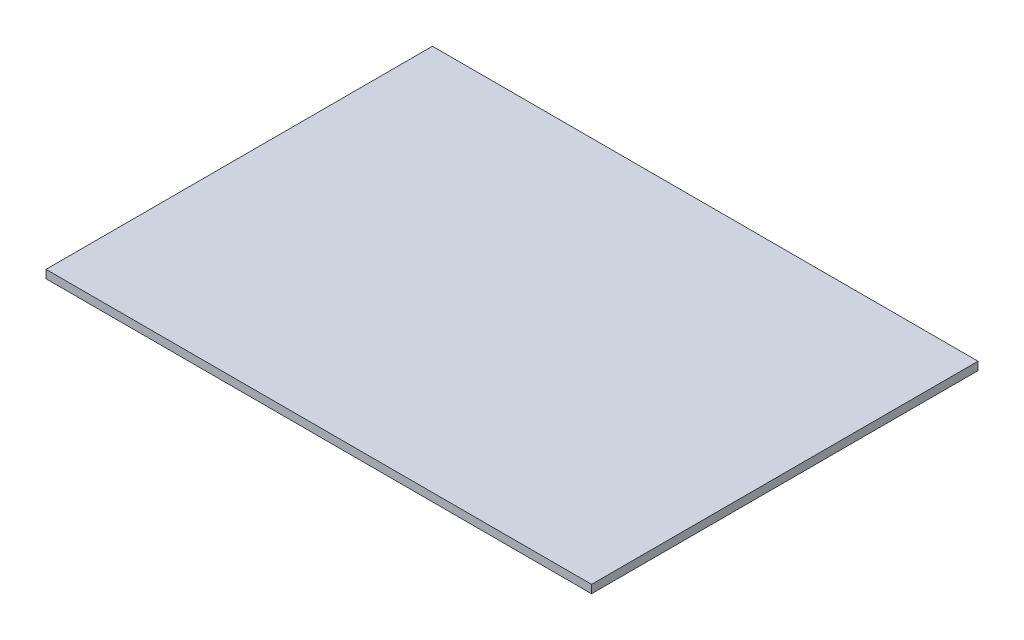
ISO-10303-21;
HEADER;
FILE_DESCRIPTION(('STEP AP214'),'2;1');
FILE_NAME('part.step','',(''),(''),'','','');
FILE_SCHEMA(('AUTOMOTIVE_DESIGN { 1 0 10303 214 1 1 1 1 }'));
ENDSEC;
DATA;
#1=APPLICATION_CONTEXT('core data for automotive mechanical design processes');
#2=APPLICATION_PROTOCOL_DEFINITION('international standard','automotive_design',2000,#1);
#3=PRODUCT_CONTEXT('',#1,'mechanical');
#4=PRODUCT('Part','Part','',(#3));
#5=PRODUCT_RELATED_PRODUCT_CATEGORY('part','',(#4));
#6=PRODUCT_DEFINITION_FORMATION('','',#4);
#7=PRODUCT_DEFINITION_CONTEXT('part definition',#1,'design');
#8=PRODUCT_DEFINITION('design','',#6,#7);
#9=PRODUCT_DEFINITION_SHAPE('','',#8);
#10=(LENGTH_UNIT() NAMED_UNIT(*) SI_UNIT(.MILLI.,.METRE.));
#11=(NAMED_UNIT(*) PLANE_ANGLE_UNIT() SI_UNIT($,.RADIAN.));
#12=(NAMED_UNIT(*) SI_UNIT($,.STERADIAN.) SOLID_ANGLE_UNIT());
#13=UNCERTAINTY_MEASURE_WITH_UNIT(LENGTH_MEASURE(1.E-05),#10,'distance_accuracy_value','');
#14=(GEOMETRIC_REPRESENTATION_CONTEXT(3) GLOBAL_UNCERTAINTY_ASSIGNED_CONTEXT((#13)) GLOBAL_UNIT_ASSIGNED_CONTEXT((#10,
#11,#12)) REPRESENTATION_CONTEXT('',''));
#15=CARTESIAN_POINT('',(0.,0.,0.));
#16=DIRECTION('',(0.,0.,1.));
#17=DIRECTION('',(1.,0.,0.));
#18=AXIS2_PLACEMENT_3D('',#15,#16,#17);
#19=CARTESIAN_POINT('',(0.,18.25625,0.));
#20=DIRECTION('',(0.,0.,-1.));
#21=DIRECTION('',(-1.,0.,0.));
#22=AXIS2_PLACEMENT_3D('',#19,#20,#21);
#23=PLANE('',#22);
#24=DIRECTION('',(1.,0.,0.));
#25=VECTOR('',#24,1.);
#26=CARTESIAN_POINT('',(0.,0.,0.));
#27=LINE('',#26,#25);
#28=CARTESIAN_POINT('',(0.,0.,0.));
#29=VERTEX_POINT('',#28);
#30=CARTESIAN_POINT('',(1219.2,0.,0.));
#31=VERTEX_POINT('',#30);
#32=EDGE_CURVE('E113',#29,#31,#27,.T.);
#33=ORIENTED_EDGE('',*,*,#32,.T.);
#34=DIRECTION('',(0.,-1.,0.));
#35=VECTOR('',#34,1.);
#36=CARTESIAN_POINT('',(1219.2,18.25625,0.));
#37=LINE('',#36,#35);
#38=CARTESIAN_POINT('',(1219.2,18.25625,0.));
#39=VERTEX_POINT('',#38);
#40=EDGE_CURVE('E11',#39,#31,#37,.T.);
#41=ORIENTED_EDGE('',*,*,#40,.F.);
#42=DIRECTION('',(1.,0.,0.));
#43=VECTOR('',#42,1.);
#44=CARTESIAN_POINT('',(0.,18.25625,0.));
#45=LINE('',#44,#43);
#46=CARTESIAN_POINT('',(0.,18.25625,0.));
#47=VERTEX_POINT('',#46);
#48=EDGE_CURVE('E95',#47,#39,#45,.T.);
#49=ORIENTED_EDGE('',*,*,#48,.F.);
#50=DIRECTION('',(0.,-1.,0.));
#51=VECTOR('',#50,1.);
#52=CARTESIAN_POINT('',(0.,18.25625,0.));
#53=LINE('',#52,#51);
#54=EDGE_CURVE('E62',#47,#29,#53,.T.);
#55=ORIENTED_EDGE('',*,*,#54,.T.);
#56=EDGE_LOOP('',(#33,#41,#49,#55));
#57=FACE_BOUND('',#56,.T.);
#58=ADVANCED_FACE('F45',(#57),#23,.F.);
#59=CARTESIAN_POINT('',(1219.2,18.25625,0.));
#60=DIRECTION('',(-1.,0.,0.));
#61=DIRECTION('',(0.,0.,1.));
#62=AXIS2_PLACEMENT_3D('',#59,#60,#61);
#63=PLANE('',#62);
#64=DIRECTION('',(0.,0.,-1.));
#65=VECTOR('',#64,1.);
#66=CARTESIAN_POINT('',(1219.2,0.,0.));
#67=LINE('',#66,#65);
#68=CARTESIAN_POINT('',(1219.2,0.,-863.6));
#69=VERTEX_POINT('',#68);
#70=EDGE_CURVE('E101',#31,#69,#67,.T.);
#71=ORIENTED_EDGE('',*,*,#70,.T.);
#72=DIRECTION('',(0.,-1.,0.));
#73=VECTOR('',#72,1.);
#74=CARTESIAN_POINT('',(1219.2,18.25625,-863.6));
#75=LINE('',#74,#73);
#76=CARTESIAN_POINT('',(1219.2,18.25625,-863.6));
#77=VERTEX_POINT('',#76);
#78=EDGE_CURVE('E54',#77,#69,#75,.T.);
#79=ORIENTED_EDGE('',*,*,#78,.F.);
#80=DIRECTION('',(0.,0.,-1.));
#81=VECTOR('',#80,1.);
#82=CARTESIAN_POINT('',(1219.2,18.25625,0.));
#83=LINE('',#82,#81);
#84=EDGE_CURVE('E87',#39,#77,#83,.T.);
#85=ORIENTED_EDGE('',*,*,#84,.F.);
#86=ORIENTED_EDGE('',*,*,#40,.T.);
#87=EDGE_LOOP('',(#71,#79,#85,#86));
#88=FACE_BOUND('',#87,.T.);
#89=ADVANCED_FACE('F100',(#88),#63,.F.);
#90=CARTESIAN_POINT('',(0.,18.25625,-863.6));
#91=DIRECTION('',(0.,0.,-1.));
#92=DIRECTION('',(-1.,0.,0.));
#93=AXIS2_PLACEMENT_3D('',#90,#91,#92);
#94=PLANE('',#93);
#95=DIRECTION('',(1.,0.,0.));
#96=VECTOR('',#95,1.);
#97=CARTESIAN_POINT('',(0.,0.,-863.6));
#98=LINE('',#97,#96);
#99=CARTESIAN_POINT('',(0.,0.,-863.6));
#100=VERTEX_POINT('',#99);
#101=EDGE_CURVE('E118',#100,#69,#98,.T.);
#102=ORIENTED_EDGE('',*,*,#101,.F.);
#103=DIRECTION('',(0.,-1.,0.));
#104=VECTOR('',#103,1.);
#105=CARTESIAN_POINT('',(0.,18.25625,-863.6));
#106=LINE('',#105,#104);
#107=CARTESIAN_POINT('',(0.,18.25625,-863.6));
#108=VERTEX_POINT('',#107);
#109=EDGE_CURVE('E76',#108,#100,#106,.T.);
#110=ORIENTED_EDGE('',*,*,#109,.F.);
#111=DIRECTION('',(1.,0.,0.));
#112=VECTOR('',#111,1.);
#113=CARTESIAN_POINT('',(0.,18.25625,-863.6));
#114=LINE('',#113,#112);
#115=EDGE_CURVE('E94',#108,#77,#114,.T.);
#116=ORIENTED_EDGE('',*,*,#115,.T.);
#117=ORIENTED_EDGE('',*,*,#78,.T.);
#118=EDGE_LOOP('',(#102,#110,#116,#117));
#119=FACE_BOUND('',#118,.T.);
#120=ADVANCED_FACE('F105',(#119),#94,.T.);
#121=CARTESIAN_POINT('',(0.,18.25625,0.));
#122=DIRECTION('',(-1.,0.,0.));
#123=DIRECTION('',(0.,0.,1.));
#124=AXIS2_PLACEMENT_3D('',#121,#122,#123);
#125=PLANE('',#124);
#126=DIRECTION('',(0.,0.,-1.));
#127=VECTOR('',#126,1.);
#128=CARTESIAN_POINT('',(0.,0.,0.));
#129=LINE('',#128,#127);
#130=EDGE_CURVE('E121',#29,#100,#129,.T.);
#131=ORIENTED_EDGE('',*,*,#130,.F.);
#132=ORIENTED_EDGE('',*,*,#54,.F.);
#133=DIRECTION('',(0.,0.,-1.));
#134=VECTOR('',#133,1.);
#135=CARTESIAN_POINT('',(0.,18.25625,0.));
#136=LINE('',#135,#134);
#137=EDGE_CURVE('E107',#47,#108,#136,.T.);
#138=ORIENTED_EDGE('',*,*,#137,.T.);
#139=ORIENTED_EDGE('',*,*,#109,.T.);
#140=EDGE_LOOP('',(#131,#132,#138,#139));
#141=FACE_BOUND('',#140,.T.);
#142=ADVANCED_FACE('F131',(#141),#125,.T.);
#143=CARTESIAN_POINT('',(0.,18.25625,0.));
#144=DIRECTION('',(0.,1.,0.));
#145=DIRECTION('',(0.,0.,1.));
#146=AXIS2_PLACEMENT_3D('',#143,#144,#145);
#147=PLANE('',#146);
#148=ORIENTED_EDGE('',*,*,#48,.T.);
#149=ORIENTED_EDGE('',*,*,#84,.T.);
#150=ORIENTED_EDGE('',*,*,#115,.F.);
#151=ORIENTED_EDGE('',*,*,#137,.F.);
#152=EDGE_LOOP('',(#148,#149,#150,#151));
#153=FACE_BOUND('',#152,.T.);
#154=ADVANCED_FACE('F91',(#153),#147,.T.);
#155=CARTESIAN_POINT('',(0.,0.,0.));
#156=DIRECTION('',(0.,1.,0.));
#157=DIRECTION('',(0.,0.,1.));
#158=AXIS2_PLACEMENT_3D('',#155,#156,#157);
#159=PLANE('',#158);
#160=ORIENTED_EDGE('',*,*,#32,.F.);
#161=ORIENTED_EDGE('',*,*,#130,.T.);
#162=ORIENTED_EDGE('',*,*,#101,.T.);
#163=ORIENTED_EDGE('',*,*,#70,.F.);
#164=EDGE_LOOP('',(#160,#161,#162,#163));
#165=FACE_BOUND('',#164,.T.);
#166=ADVANCED_FACE('F130',(#165),#159,.F.);
#167=CLOSED_SHELL('',(#58,#89,#120,#142,#154,#166));
#168=MANIFOLD_SOLID_BREP('B2',#167);
#169=ADVANCED_BREP_SHAPE_REPRESENTATION('',(#18,#168),#14);
#170=SHAPE_DEFINITION_REPRESENTATION(#9,#169);
ENDSEC;
END-ISO-10303-21;
